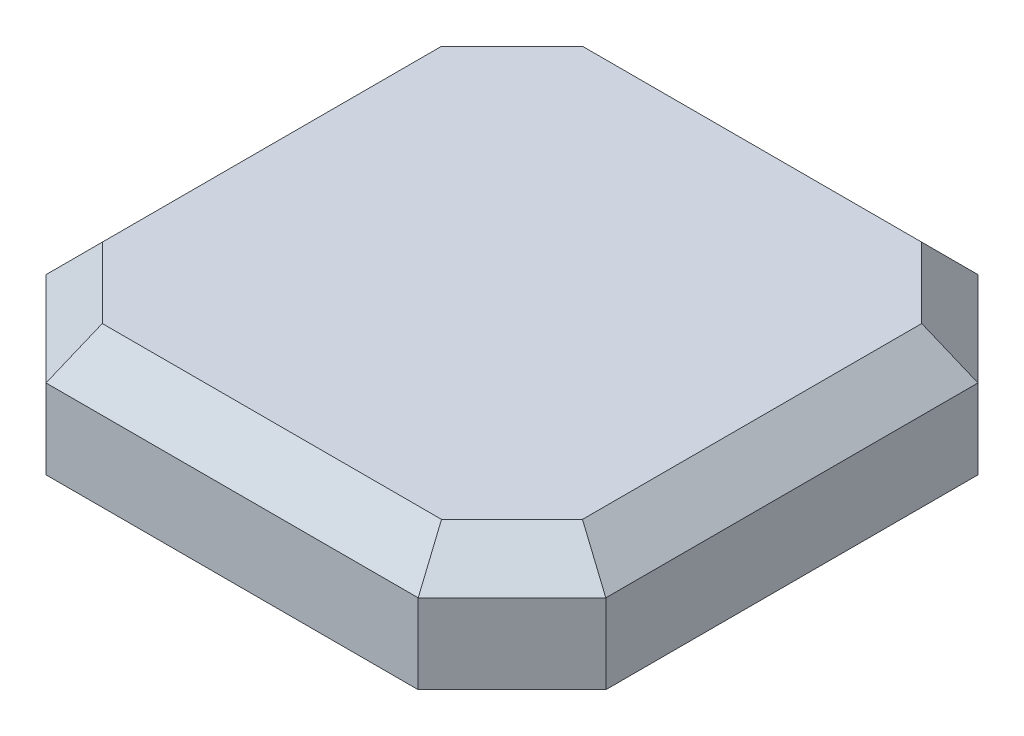
ISO-10303-21;
HEADER;
FILE_DESCRIPTION(('STEP AP214'),'2;1');
FILE_NAME('part.step','',(''),(''),'','','');
FILE_SCHEMA(('AUTOMOTIVE_DESIGN { 1 0 10303 214 1 1 1 1 }'));
ENDSEC;
DATA;
#1=APPLICATION_CONTEXT('core data for automotive mechanical design processes');
#2=APPLICATION_PROTOCOL_DEFINITION('international standard','automotive_design',2000,#1);
#3=PRODUCT_CONTEXT('',#1,'mechanical');
#4=PRODUCT('Part','Part','',(#3));
#5=PRODUCT_RELATED_PRODUCT_CATEGORY('part','',(#4));
#6=PRODUCT_DEFINITION_FORMATION('','',#4);
#7=PRODUCT_DEFINITION_CONTEXT('part definition',#1,'design');
#8=PRODUCT_DEFINITION('design','',#6,#7);
#9=PRODUCT_DEFINITION_SHAPE('','',#8);
#10=(LENGTH_UNIT() NAMED_UNIT(*) SI_UNIT(.MILLI.,.METRE.));
#11=(NAMED_UNIT(*) PLANE_ANGLE_UNIT() SI_UNIT($,.RADIAN.));
#12=(NAMED_UNIT(*) SI_UNIT($,.STERADIAN.) SOLID_ANGLE_UNIT());
#13=UNCERTAINTY_MEASURE_WITH_UNIT(LENGTH_MEASURE(1.E-05),#10,'distance_accuracy_value','');
#14=(GEOMETRIC_REPRESENTATION_CONTEXT(3) GLOBAL_UNCERTAINTY_ASSIGNED_CONTEXT((#13)) GLOBAL_UNIT_ASSIGNED_CONTEXT((#10,
#11,#12)) REPRESENTATION_CONTEXT('',''));
#15=CARTESIAN_POINT('',(0.,0.,0.));
#16=DIRECTION('',(0.,0.,1.));
#17=DIRECTION('',(1.,0.,0.));
#18=AXIS2_PLACEMENT_3D('',#15,#16,#17);
#19=CARTESIAN_POINT('',(-18.4035621925041,9.,-20.2102447448742));
#20=DIRECTION('',(0.,0.,1.));
#21=DIRECTION('',(1.,0.,0.));
#22=AXIS2_PLACEMENT_3D('',#19,#20,#21);
#23=PLANE('',#22);
#24=DIRECTION('',(0.,-1.,0.));
#25=VECTOR('',#24,1.);
#26=CARTESIAN_POINT('',(-18.4035621925041,9.,-20.2102447448742));
#27=LINE('',#26,#25);
#28=CARTESIAN_POINT('',(-18.4035621925041,6.,-20.2102447448742));
#29=VERTEX_POINT('',#28);
#30=CARTESIAN_POINT('',(-18.4035621925041,0.,-20.2102447448742));
#31=VERTEX_POINT('',#30);
#32=EDGE_CURVE('E135',#29,#31,#27,.T.);
#33=ORIENTED_EDGE('',*,*,#32,.F.);
#34=DIRECTION('',(1.,0.,0.));
#35=VECTOR('',#34,1.);
#36=CARTESIAN_POINT('',(9.65430218376519,6.,-20.210244744874));
#37=LINE('',#36,#35);
#38=CARTESIAN_POINT('',(9.65430218376519,6.,-20.210244744874));
#39=VERTEX_POINT('',#38);
#40=EDGE_CURVE('E255',#29,#39,#37,.T.);
#41=ORIENTED_EDGE('',*,*,#40,.T.);
#42=DIRECTION('',(0.,-1.,0.));
#43=VECTOR('',#42,1.);
#44=CARTESIAN_POINT('',(9.65430218376519,9.,-20.210244744874));
#45=LINE('',#44,#43);
#46=CARTESIAN_POINT('',(9.65430218376519,0.,-20.210244744874));
#47=VERTEX_POINT('',#46);
#48=EDGE_CURVE('E158',#39,#47,#45,.T.);
#49=ORIENTED_EDGE('',*,*,#48,.T.);
#50=DIRECTION('',(-1.,0.,0.));
#51=VECTOR('',#50,1.);
#52=CARTESIAN_POINT('',(-18.4035621925041,0.,-20.2102447448742));
#53=LINE('',#52,#51);
#54=EDGE_CURVE('E151',#47,#31,#53,.T.);
#55=ORIENTED_EDGE('',*,*,#54,.T.);
#56=EDGE_LOOP('',(#33,#41,#49,#55));
#57=FACE_BOUND('',#56,.T.);
#58=ADVANCED_FACE('F45',(#57),#23,.F.);
#59=CARTESIAN_POINT('',(-18.4035621925041,9.,-20.2102447448742));
#60=DIRECTION('',(0.707106781186551,0.,0.707106781186544));
#61=DIRECTION('',(0.707106781186544,0.,-0.707106781186551));
#62=AXIS2_PLACEMENT_3D('',#59,#60,#61);
#63=PLANE('',#62);
#64=DIRECTION('',(0.,-1.,0.));
#65=VECTOR('',#64,1.);
#66=CARTESIAN_POINT('',(-25.4746300043695,9.,-13.1391769330087));
#67=LINE('',#66,#65);
#68=CARTESIAN_POINT('',(-25.4746300043695,6.,-13.1391769330087));
#69=VERTEX_POINT('',#68);
#70=CARTESIAN_POINT('',(-25.4746300043695,0.,-13.1391769330087));
#71=VERTEX_POINT('',#70);
#72=EDGE_CURVE('E145',#69,#71,#67,.T.);
#73=ORIENTED_EDGE('',*,*,#72,.F.);
#74=DIRECTION('',(0.707106781186544,0.,-0.707106781186551));
#75=VECTOR('',#74,1.);
#76=CARTESIAN_POINT('',(-18.4035621925041,6.,-20.2102447448742));
#77=LINE('',#76,#75);
#78=EDGE_CURVE('E62',#69,#29,#77,.T.);
#79=ORIENTED_EDGE('',*,*,#78,.T.);
#80=ORIENTED_EDGE('',*,*,#32,.T.);
#81=DIRECTION('',(-0.707106781186544,0.,0.707106781186551));
#82=VECTOR('',#81,1.);
#83=CARTESIAN_POINT('',(-18.4035621925041,0.,-20.2102447448742));
#84=LINE('',#83,#82);
#85=EDGE_CURVE('E138',#31,#71,#84,.T.);
#86=ORIENTED_EDGE('',*,*,#85,.T.);
#87=EDGE_LOOP('',(#73,#79,#80,#86));
#88=FACE_BOUND('',#87,.T.);
#89=ADVANCED_FACE('F137',(#88),#63,.F.);
#90=CARTESIAN_POINT('',(-25.4746300043693,9.,14.9186874432606));
#91=DIRECTION('',(1.,0.,0.));
#92=DIRECTION('',(0.,0.,-1.));
#93=AXIS2_PLACEMENT_3D('',#90,#91,#92);
#94=PLANE('',#93);
#95=DIRECTION('',(0.,-1.,0.));
#96=VECTOR('',#95,1.);
#97=CARTESIAN_POINT('',(-25.4746300043693,9.,14.9186874432606));
#98=LINE('',#97,#96);
#99=CARTESIAN_POINT('',(-25.4746300043693,6.,14.9186874432606));
#100=VERTEX_POINT('',#99);
#101=CARTESIAN_POINT('',(-25.4746300043693,0.,14.9186874432606));
#102=VERTEX_POINT('',#101);
#103=EDGE_CURVE('E206',#100,#102,#98,.T.);
#104=ORIENTED_EDGE('',*,*,#103,.F.);
#105=DIRECTION('',(0.,0.,-1.));
#106=VECTOR('',#105,1.);
#107=CARTESIAN_POINT('',(-25.4746300043695,6.,-13.1391769330087));
#108=LINE('',#107,#106);
#109=EDGE_CURVE('E70',#100,#69,#108,.T.);
#110=ORIENTED_EDGE('',*,*,#109,.T.);
#111=ORIENTED_EDGE('',*,*,#72,.T.);
#112=DIRECTION('',(0.,0.,1.));
#113=VECTOR('',#112,1.);
#114=CARTESIAN_POINT('',(-25.4746300043693,0.,14.9186874432606));
#115=LINE('',#114,#113);
#116=EDGE_CURVE('E154',#71,#102,#115,.T.);
#117=ORIENTED_EDGE('',*,*,#116,.T.);
#118=EDGE_LOOP('',(#104,#110,#111,#117));
#119=FACE_BOUND('',#118,.T.);
#120=ADVANCED_FACE('F329',(#119),#94,.F.);
#121=CARTESIAN_POINT('',(-25.4746300043693,9.,14.9186874432606));
#122=DIRECTION('',(0.707106781186543,0.,-0.707106781186552));
#123=DIRECTION('',(-0.707106781186552,0.,-0.707106781186543));
#124=AXIS2_PLACEMENT_3D('',#121,#122,#123);
#125=PLANE('',#124);
#126=DIRECTION('',(0.,-1.,0.));
#127=VECTOR('',#126,1.);
#128=CARTESIAN_POINT('',(-18.4035621925038,9.,21.989755255126));
#129=LINE('',#128,#127);
#130=CARTESIAN_POINT('',(-18.4035621925038,6.,21.989755255126));
#131=VERTEX_POINT('',#130);
#132=CARTESIAN_POINT('',(-18.4035621925038,0.,21.989755255126));
#133=VERTEX_POINT('',#132);
#134=EDGE_CURVE('E203',#131,#133,#129,.T.);
#135=ORIENTED_EDGE('',*,*,#134,.F.);
#136=DIRECTION('',(-0.707106781186552,0.,-0.707106781186543));
#137=VECTOR('',#136,1.);
#138=CARTESIAN_POINT('',(-25.4746300043693,6.,14.9186874432606));
#139=LINE('',#138,#137);
#140=EDGE_CURVE('E248',#131,#100,#139,.T.);
#141=ORIENTED_EDGE('',*,*,#140,.T.);
#142=ORIENTED_EDGE('',*,*,#103,.T.);
#143=DIRECTION('',(0.707106781186552,0.,0.707106781186543));
#144=VECTOR('',#143,1.);
#145=CARTESIAN_POINT('',(-25.4746300043693,0.,14.9186874432606));
#146=LINE('',#145,#144);
#147=EDGE_CURVE('E173',#102,#133,#146,.T.);
#148=ORIENTED_EDGE('',*,*,#147,.T.);
#149=EDGE_LOOP('',(#135,#141,#142,#148));
#150=FACE_BOUND('',#149,.T.);
#151=ADVANCED_FACE('F392',(#150),#125,.F.);
#152=CARTESIAN_POINT('',(-18.4035621925038,9.,21.989755255126));
#153=DIRECTION('',(0.,0.,-1.));
#154=DIRECTION('',(-1.,0.,0.));
#155=AXIS2_PLACEMENT_3D('',#152,#153,#154);
#156=PLANE('',#155);
#157=DIRECTION('',(0.,-1.,0.));
#158=VECTOR('',#157,1.);
#159=CARTESIAN_POINT('',(9.65430218376526,9.,21.989755255126));
#160=LINE('',#159,#158);
#161=CARTESIAN_POINT('',(9.65430218376526,6.,21.989755255126));
#162=VERTEX_POINT('',#161);
#163=CARTESIAN_POINT('',(9.65430218376526,0.,21.989755255126));
#164=VERTEX_POINT('',#163);
#165=EDGE_CURVE('E200',#162,#164,#160,.T.);
#166=ORIENTED_EDGE('',*,*,#165,.F.);
#167=DIRECTION('',(-1.,0.,0.));
#168=VECTOR('',#167,1.);
#169=CARTESIAN_POINT('',(-18.4035621925038,6.,21.989755255126));
#170=LINE('',#169,#168);
#171=EDGE_CURVE('E245',#162,#131,#170,.T.);
#172=ORIENTED_EDGE('',*,*,#171,.T.);
#173=ORIENTED_EDGE('',*,*,#134,.T.);
#174=DIRECTION('',(1.,0.,0.));
#175=VECTOR('',#174,1.);
#176=CARTESIAN_POINT('',(-18.4035621925038,0.,21.989755255126));
#177=LINE('',#176,#175);
#178=EDGE_CURVE('E177',#133,#164,#177,.T.);
#179=ORIENTED_EDGE('',*,*,#178,.T.);
#180=EDGE_LOOP('',(#166,#172,#173,#179));
#181=FACE_BOUND('',#180,.T.);
#182=ADVANCED_FACE('F398',(#181),#156,.F.);
#183=CARTESIAN_POINT('',(9.65430218376526,9.,21.989755255126));
#184=DIRECTION('',(-0.707106781186551,0.,-0.707106781186544));
#185=DIRECTION('',(-0.707106781186544,0.,0.707106781186551));
#186=AXIS2_PLACEMENT_3D('',#183,#184,#185);
#187=PLANE('',#186);
#188=DIRECTION('',(0.,-1.,0.));
#189=VECTOR('',#188,1.);
#190=CARTESIAN_POINT('',(16.7253699956307,9.,14.9186874432605));
#191=LINE('',#190,#189);
#192=CARTESIAN_POINT('',(16.7253699956307,6.,14.9186874432605));
#193=VERTEX_POINT('',#192);
#194=CARTESIAN_POINT('',(16.7253699956307,0.,14.9186874432605));
#195=VERTEX_POINT('',#194);
#196=EDGE_CURVE('E197',#193,#195,#191,.T.);
#197=ORIENTED_EDGE('',*,*,#196,.F.);
#198=DIRECTION('',(-0.707106781186544,0.,0.707106781186551));
#199=VECTOR('',#198,1.);
#200=CARTESIAN_POINT('',(9.65430218376526,6.,21.989755255126));
#201=LINE('',#200,#199);
#202=EDGE_CURVE('E242',#193,#162,#201,.T.);
#203=ORIENTED_EDGE('',*,*,#202,.T.);
#204=ORIENTED_EDGE('',*,*,#165,.T.);
#205=DIRECTION('',(0.707106781186544,0.,-0.707106781186551));
#206=VECTOR('',#205,1.);
#207=CARTESIAN_POINT('',(9.65430218376526,0.,21.989755255126));
#208=LINE('',#207,#206);
#209=EDGE_CURVE('E181',#164,#195,#208,.T.);
#210=ORIENTED_EDGE('',*,*,#209,.T.);
#211=EDGE_LOOP('',(#197,#203,#204,#210));
#212=FACE_BOUND('',#211,.T.);
#213=ADVANCED_FACE('F401',(#212),#187,.F.);
#214=CARTESIAN_POINT('',(16.7253699956307,9.,14.9186874432605));
#215=DIRECTION('',(-1.,0.,0.));
#216=DIRECTION('',(0.,0.,1.));
#217=AXIS2_PLACEMENT_3D('',#214,#215,#216);
#218=PLANE('',#217);
#219=DIRECTION('',(0.,-1.,0.));
#220=VECTOR('',#219,1.);
#221=CARTESIAN_POINT('',(16.7253699956307,9.,-13.1391769330086));
#222=LINE('',#221,#220);
#223=CARTESIAN_POINT('',(16.7253699956307,6.,-13.1391769330086));
#224=VERTEX_POINT('',#223);
#225=CARTESIAN_POINT('',(16.7253699956307,0.,-13.1391769330086));
#226=VERTEX_POINT('',#225);
#227=EDGE_CURVE('E194',#224,#226,#222,.T.);
#228=ORIENTED_EDGE('',*,*,#227,.F.);
#229=DIRECTION('',(0.,0.,1.));
#230=VECTOR('',#229,1.);
#231=CARTESIAN_POINT('',(16.7253699956307,6.,14.9186874432605));
#232=LINE('',#231,#230);
#233=EDGE_CURVE('E239',#224,#193,#232,.T.);
#234=ORIENTED_EDGE('',*,*,#233,.T.);
#235=ORIENTED_EDGE('',*,*,#196,.T.);
#236=DIRECTION('',(0.,0.,-1.));
#237=VECTOR('',#236,1.);
#238=CARTESIAN_POINT('',(16.7253699956307,0.,14.9186874432605));
#239=LINE('',#238,#237);
#240=EDGE_CURVE('E185',#195,#226,#239,.T.);
#241=ORIENTED_EDGE('',*,*,#240,.T.);
#242=EDGE_LOOP('',(#228,#234,#235,#241));
#243=FACE_BOUND('',#242,.T.);
#244=ADVANCED_FACE('F421',(#243),#218,.F.);
#245=CARTESIAN_POINT('',(16.7253699956307,9.,-13.1391769330086));
#246=DIRECTION('',(-0.707106781186544,0.,0.707106781186552));
#247=DIRECTION('',(0.707106781186552,0.,0.707106781186544));
#248=AXIS2_PLACEMENT_3D('',#245,#246,#247);
#249=PLANE('',#248);
#250=ORIENTED_EDGE('',*,*,#48,.F.);
#251=DIRECTION('',(0.707106781186552,0.,0.707106781186544));
#252=VECTOR('',#251,1.);
#253=CARTESIAN_POINT('',(16.7253699956307,6.,-13.1391769330086));
#254=LINE('',#253,#252);
#255=EDGE_CURVE('E235',#39,#224,#254,.T.);
#256=ORIENTED_EDGE('',*,*,#255,.T.);
#257=ORIENTED_EDGE('',*,*,#227,.T.);
#258=DIRECTION('',(-0.707106781186551,0.,-0.707106781186543));
#259=VECTOR('',#258,1.);
#260=CARTESIAN_POINT('',(16.7253699956307,0.,-13.1391769330086));
#261=LINE('',#260,#259);
#262=EDGE_CURVE('E189',#226,#47,#261,.T.);
#263=ORIENTED_EDGE('',*,*,#262,.T.);
#264=EDGE_LOOP('',(#250,#256,#257,#263));
#265=FACE_BOUND('',#264,.T.);
#266=ADVANCED_FACE('F418',(#265),#249,.F.);
#267=CARTESIAN_POINT('',(0.,9.,0.));
#268=DIRECTION('',(0.,1.,0.));
#269=DIRECTION('',(0.,0.,1.));
#270=AXIS2_PLACEMENT_3D('',#267,#268,#269);
#271=PLANE('',#270);
#272=DIRECTION('',(0.,0.,-1.));
#273=VECTOR('',#272,1.);
#274=CARTESIAN_POINT('',(13.7253699956307,9.,-13.1391769330086));
#275=LINE('',#274,#273);
#276=CARTESIAN_POINT('',(13.7253699956307,9.,13.6760467561412));
#277=VERTEX_POINT('',#276);
#278=CARTESIAN_POINT('',(13.7253699956307,9.,-11.8965362458893));
#279=VERTEX_POINT('',#278);
#280=EDGE_CURVE('E228',#277,#279,#275,.T.);
#281=ORIENTED_EDGE('',*,*,#280,.T.);
#282=DIRECTION('',(-0.707106781186552,0.,-0.707106781186544));
#283=VECTOR('',#282,1.);
#284=CARTESIAN_POINT('',(7.53298184020556,9.,-18.0889244013144));
#285=LINE('',#284,#283);
#286=CARTESIAN_POINT('',(8.4116614966459,9.,-17.210244744874));
#287=VERTEX_POINT('',#286);
#288=EDGE_CURVE('E231',#279,#287,#285,.T.);
#289=ORIENTED_EDGE('',*,*,#288,.T.);
#290=DIRECTION('',(-1.,0.,0.));
#291=VECTOR('',#290,1.);
#292=CARTESIAN_POINT('',(-18.4035621925041,9.,-17.2102447448742));
#293=LINE('',#292,#291);
#294=CARTESIAN_POINT('',(-17.1609215053848,9.,-17.2102447448742));
#295=VERTEX_POINT('',#294);
#296=EDGE_CURVE('E144',#287,#295,#293,.T.);
#297=ORIENTED_EDGE('',*,*,#296,.T.);
#298=DIRECTION('',(-0.707106781186544,0.,0.707106781186551));
#299=VECTOR('',#298,1.);
#300=CARTESIAN_POINT('',(-23.3533096608099,9.,-11.0178565894491));
#301=LINE('',#300,#299);
#302=CARTESIAN_POINT('',(-22.4746300043695,9.,-11.8965362458894));
#303=VERTEX_POINT('',#302);
#304=EDGE_CURVE('E213',#295,#303,#301,.T.);
#305=ORIENTED_EDGE('',*,*,#304,.T.);
#306=DIRECTION('',(0.,0.,1.));
#307=VECTOR('',#306,1.);
#308=CARTESIAN_POINT('',(-22.4746300043693,9.,14.9186874432605));
#309=LINE('',#308,#307);
#310=CARTESIAN_POINT('',(-22.4746300043693,9.,13.6760467561413));
#311=VERTEX_POINT('',#310);
#312=EDGE_CURVE('E216',#303,#311,#309,.T.);
#313=ORIENTED_EDGE('',*,*,#312,.T.);
#314=DIRECTION('',(0.707106781186552,0.,0.707106781186543));
#315=VECTOR('',#314,1.);
#316=CARTESIAN_POINT('',(-16.2822418489442,9.,19.8684349115663));
#317=LINE('',#316,#315);
#318=CARTESIAN_POINT('',(-17.1609215053845,9.,18.989755255126));
#319=VERTEX_POINT('',#318);
#320=EDGE_CURVE('E219',#311,#319,#317,.T.);
#321=ORIENTED_EDGE('',*,*,#320,.T.);
#322=DIRECTION('',(1.,0.,0.));
#323=VECTOR('',#322,1.);
#324=CARTESIAN_POINT('',(9.65430218376526,9.,18.989755255126));
#325=LINE('',#324,#323);
#326=CARTESIAN_POINT('',(8.41166149664597,9.,18.989755255126));
#327=VERTEX_POINT('',#326);
#328=EDGE_CURVE('E222',#319,#327,#325,.T.);
#329=ORIENTED_EDGE('',*,*,#328,.T.);
#330=DIRECTION('',(0.707106781186544,0.,-0.707106781186551));
#331=VECTOR('',#330,1.);
#332=CARTESIAN_POINT('',(14.604049652071,9.,12.7973670997008));
#333=LINE('',#332,#331);
#334=EDGE_CURVE('E225',#327,#277,#333,.T.);
#335=ORIENTED_EDGE('',*,*,#334,.T.);
#336=EDGE_LOOP('',(#281,#289,#297,#305,#313,#321,#329,#335));
#337=FACE_BOUND('',#336,.T.);
#338=ADVANCED_FACE('F298',(#337),#271,.T.);
#339=CARTESIAN_POINT('',(0.,0.,0.));
#340=DIRECTION('',(0.,1.,0.));
#341=DIRECTION('',(0.,0.,1.));
#342=AXIS2_PLACEMENT_3D('',#339,#340,#341);
#343=PLANE('',#342);
#344=CARTESIAN_POINT('',(-18.1840918223829,0.,14.6992170731394));
#345=DIRECTION('',(0.,1.,0.));
#346=DIRECTION('',(0.,0.,1.));
#347=AXIS2_PLACEMENT_3D('',#344,#345,#346);
#348=CIRCLE('',#347,3.);
#349=CARTESIAN_POINT('',(-18.1840918223829,0.,17.6992170731394));
#350=VERTEX_POINT('',#349);
#351=EDGE_CURVE('E11',#350,#350,#348,.F.);
#352=ORIENTED_EDGE('',*,*,#351,.F.);
#353=EDGE_LOOP('',(#352));
#354=FACE_BOUND('',#353,.T.);
#355=CARTESIAN_POINT('',(-18.1840918223828,0.,-12.9197065628881));
#356=DIRECTION('',(0.,1.,0.));
#357=DIRECTION('',(0.,0.,1.));
#358=AXIS2_PLACEMENT_3D('',#355,#356,#357);
#359=CIRCLE('',#358,3.);
#360=CARTESIAN_POINT('',(-18.1840918223828,0.,-9.91970656288806));
#361=VERTEX_POINT('',#360);
#362=EDGE_CURVE('E55',#361,#361,#359,.F.);
#363=ORIENTED_EDGE('',*,*,#362,.F.);
#364=EDGE_LOOP('',(#363));
#365=FACE_BOUND('',#364,.T.);
#366=CARTESIAN_POINT('',(9.43483181364467,0.,-12.9197065628878));
#367=DIRECTION('',(0.,1.,0.));
#368=DIRECTION('',(0.,0.,1.));
#369=AXIS2_PLACEMENT_3D('',#366,#367,#368);
#370=CIRCLE('',#369,3.);
#371=CARTESIAN_POINT('',(9.43483181364467,0.,-9.91970656288782));
#372=VERTEX_POINT('',#371);
#373=EDGE_CURVE('E287',#372,#372,#370,.F.);
#374=ORIENTED_EDGE('',*,*,#373,.F.);
#375=EDGE_LOOP('',(#374));
#376=FACE_BOUND('',#375,.T.);
#377=CARTESIAN_POINT('',(9.43483181364433,0.,14.6992170731396));
#378=DIRECTION('',(0.,1.,0.));
#379=DIRECTION('',(0.,0.,1.));
#380=AXIS2_PLACEMENT_3D('',#377,#378,#379);
#381=CIRCLE('',#380,3.);
#382=CARTESIAN_POINT('',(9.43483181364433,0.,17.6992170731396));
#383=VERTEX_POINT('',#382);
#384=EDGE_CURVE('E258',#383,#383,#381,.F.);
#385=ORIENTED_EDGE('',*,*,#384,.F.);
#386=EDGE_LOOP('',(#385));
#387=FACE_BOUND('',#386,.T.);
#388=ORIENTED_EDGE('',*,*,#54,.F.);
#389=ORIENTED_EDGE('',*,*,#262,.F.);
#390=ORIENTED_EDGE('',*,*,#240,.F.);
#391=ORIENTED_EDGE('',*,*,#209,.F.);
#392=ORIENTED_EDGE('',*,*,#178,.F.);
#393=ORIENTED_EDGE('',*,*,#147,.F.);
#394=ORIENTED_EDGE('',*,*,#116,.F.);
#395=ORIENTED_EDGE('',*,*,#85,.F.);
#396=EDGE_LOOP('',(#388,#389,#390,#391,#392,#393,#394,#395));
#397=FACE_BOUND('',#396,.T.);
#398=ADVANCED_FACE('F149',(#354,#365,#376,#387,#397),#343,.F.);
#399=CARTESIAN_POINT('',(-18.0753383802552,9.,18.0753383802554));
#400=DIRECTION('',(-0.499999999999998,0.707106781186546,0.500000000000004));
#401=DIRECTION('',(-0.707106781186552,0.,-0.707106781186543));
#402=AXIS2_PLACEMENT_3D('',#399,#400,#401);
#403=PLANE('',#402);
#404=DIRECTION('',(0.678598344545845,0.678598344545848,-0.281084637714823));
#405=VECTOR('',#404,1.);
#406=CARTESIAN_POINT('',(-19.8660120249335,11.6086179794358,12.5955218100086));
#407=LINE('',#406,#405);
#408=EDGE_CURVE('E165',#100,#311,#407,.T.);
#409=ORIENTED_EDGE('',*,*,#408,.F.);
#410=ORIENTED_EDGE('',*,*,#140,.F.);
#411=DIRECTION('',(0.281084637714816,0.678598344545849,-0.678598344545847));
#412=VECTOR('',#411,1.);
#413=CARTESIAN_POINT('',(-17.0587491392805,9.24666591194817,18.7430893431778));
#414=LINE('',#413,#412);
#415=EDGE_CURVE('E161',#319,#131,#414,.F.);
#416=ORIENTED_EDGE('',*,*,#415,.F.);
#417=ORIENTED_EDGE('',*,*,#320,.F.);
#418=EDGE_LOOP('',(#409,#410,#416,#417));
#419=FACE_BOUND('',#418,.T.);
#420=ADVANCED_FACE('F48',(#419),#403,.T.);
#421=CARTESIAN_POINT('',(0.,9.,18.989755255126));
#422=DIRECTION('',(0.,0.707106781186547,0.707106781186548));
#423=DIRECTION('',(-1.,0.,0.));
#424=AXIS2_PLACEMENT_3D('',#421,#422,#423);
#425=PLANE('',#424);
#426=ORIENTED_EDGE('',*,*,#415,.T.);
#427=ORIENTED_EDGE('',*,*,#171,.F.);
#428=DIRECTION('',(-0.281084637714822,0.678598344545847,-0.678598344545846));
#429=VECTOR('',#428,1.);
#430=CARTESIAN_POINT('',(7.74706812053252,10.6044703420764,17.3852849130496));
#431=LINE('',#430,#429);
#432=EDGE_CURVE('E277',#327,#162,#431,.F.);
#433=ORIENTED_EDGE('',*,*,#432,.F.);
#434=ORIENTED_EDGE('',*,*,#328,.F.);
#435=EDGE_LOOP('',(#426,#427,#433,#434));
#436=FACE_BOUND('',#435,.T.);
#437=ADVANCED_FACE('F373',(#436),#425,.T.);
#438=CARTESIAN_POINT('',(-22.4746300043694,9.,1.63964640916247E-13));
#439=DIRECTION('',(-0.707106781186548,0.707106781186547,0.));
#440=DIRECTION('',(0.,0.,-1.));
#441=AXIS2_PLACEMENT_3D('',#438,#439,#440);
#442=PLANE('',#441);
#443=ORIENTED_EDGE('',*,*,#408,.T.);
#444=ORIENTED_EDGE('',*,*,#312,.F.);
#445=DIRECTION('',(0.678598344545848,0.678598344545847,0.281084637714816));
#446=VECTOR('',#445,1.);
#447=CARTESIAN_POINT('',(-21.0478982722053,10.4267317321642,-11.305564612559));
#448=LINE('',#447,#446);
#449=EDGE_CURVE('E273',#69,#303,#448,.T.);
#450=ORIENTED_EDGE('',*,*,#449,.F.);
#451=ORIENTED_EDGE('',*,*,#109,.F.);
#452=EDGE_LOOP('',(#443,#444,#450,#451));
#453=FACE_BOUND('',#452,.T.);
#454=ADVANCED_FACE('F367',(#453),#442,.T.);
#455=CARTESIAN_POINT('',(13.700708375886,9.,13.7007083758859));
#456=DIRECTION('',(0.500000000000003,0.707106781186547,0.499999999999998));
#457=DIRECTION('',(-0.707106781186544,0.,0.707106781186551));
#458=AXIS2_PLACEMENT_3D('',#455,#456,#457);
#459=PLANE('',#458);
#460=ORIENTED_EDGE('',*,*,#432,.T.);
#461=ORIENTED_EDGE('',*,*,#202,.F.);
#462=DIRECTION('',(-0.678598344545847,0.678598344545848,-0.281084637714818));
#463=VECTOR('',#462,1.);
#464=CARTESIAN_POINT('',(13.7187174708451,9.00665252478559,13.673291190151));
#465=LINE('',#464,#463);
#466=EDGE_CURVE('E269',#277,#193,#465,.F.);
#467=ORIENTED_EDGE('',*,*,#466,.F.);
#468=ORIENTED_EDGE('',*,*,#334,.F.);
#469=EDGE_LOOP('',(#460,#461,#467,#468));
#470=FACE_BOUND('',#469,.T.);
#471=ADVANCED_FACE('F360',(#470),#459,.T.);
#472=CARTESIAN_POINT('',(-17.1855831251296,9.,-17.1855831251294));
#473=DIRECTION('',(-0.500000000000003,0.707106781186547,-0.499999999999997));
#474=DIRECTION('',(0.707106781186544,0.,-0.707106781186551));
#475=AXIS2_PLACEMENT_3D('',#472,#473,#474);
#476=PLANE('',#475);
#477=ORIENTED_EDGE('',*,*,#449,.T.);
#478=ORIENTED_EDGE('',*,*,#304,.F.);
#479=DIRECTION('',(0.281084637714821,0.678598344545847,0.678598344545847));
#480=VECTOR('',#479,1.);
#481=CARTESIAN_POINT('',(-15.8050615762817,12.273335429519,-13.9369093153553));
#482=LINE('',#481,#480);
#483=EDGE_CURVE('E265',#29,#295,#482,.T.);
#484=ORIENTED_EDGE('',*,*,#483,.F.);
#485=ORIENTED_EDGE('',*,*,#78,.F.);
#486=EDGE_LOOP('',(#477,#478,#484,#485));
#487=FACE_BOUND('',#486,.T.);
#488=ADVANCED_FACE('F353',(#487),#476,.T.);
#489=CARTESIAN_POINT('',(13.7253699956307,9.,0.));
#490=DIRECTION('',(0.707106781186548,0.707106781186547,0.));
#491=DIRECTION('',(0.,0.,1.));
#492=AXIS2_PLACEMENT_3D('',#489,#490,#491);
#493=PLANE('',#492);
#494=ORIENTED_EDGE('',*,*,#466,.T.);
#495=ORIENTED_EDGE('',*,*,#233,.F.);
#496=DIRECTION('',(-0.678598344545846,0.678598344545847,0.281084637714823));
#497=VECTOR('',#496,1.);
#498=CARTESIAN_POINT('',(11.4561822034713,11.2691877921594,-10.9566078868054));
#499=LINE('',#498,#497);
#500=EDGE_CURVE('E262',#279,#224,#499,.F.);
#501=ORIENTED_EDGE('',*,*,#500,.F.);
#502=ORIENTED_EDGE('',*,*,#280,.F.);
#503=EDGE_LOOP('',(#494,#495,#501,#502));
#504=FACE_BOUND('',#503,.T.);
#505=ADVANCED_FACE('F346',(#504),#493,.T.);
#506=CARTESIAN_POINT('',(1.23429986030329E-13,9.,-17.2102447448741));
#507=DIRECTION('',(0.,0.707106781186547,-0.707106781186548));
#508=DIRECTION('',(1.,0.,0.));
#509=AXIS2_PLACEMENT_3D('',#506,#507,#508);
#510=PLANE('',#509);
#511=ORIENTED_EDGE('',*,*,#483,.T.);
#512=ORIENTED_EDGE('',*,*,#296,.F.);
#513=DIRECTION('',(0.281084637714821,-0.678598344545849,-0.678598344545845));
#514=VECTOR('',#513,1.);
#515=CARTESIAN_POINT('',(7.74706812053248,10.6044703420763,-15.6057744027977));
#516=LINE('',#515,#514);
#517=EDGE_CURVE('E259',#39,#287,#516,.F.);
#518=ORIENTED_EDGE('',*,*,#517,.F.);
#519=ORIENTED_EDGE('',*,*,#40,.F.);
#520=EDGE_LOOP('',(#511,#512,#518,#519));
#521=FACE_BOUND('',#520,.T.);
#522=ADVANCED_FACE('F339',(#521),#510,.T.);
#523=CARTESIAN_POINT('',(12.8109531207599,9.,-12.8109531207601));
#524=DIRECTION('',(0.499999999999998,0.707106781186547,-0.500000000000003));
#525=DIRECTION('',(0.707106781186552,0.,0.707106781186544));
#526=AXIS2_PLACEMENT_3D('',#523,#524,#525);
#527=PLANE('',#526);
#528=ORIENTED_EDGE('',*,*,#500,.T.);
#529=ORIENTED_EDGE('',*,*,#255,.F.);
#530=ORIENTED_EDGE('',*,*,#517,.T.);
#531=ORIENTED_EDGE('',*,*,#288,.F.);
#532=EDGE_LOOP('',(#528,#529,#530,#531));
#533=FACE_BOUND('',#532,.T.);
#534=ADVANCED_FACE('F319',(#533),#527,.T.);
#535=CARTESIAN_POINT('',(9.43483181364433,-1.,14.6992170731396));
#536=DIRECTION('',(0.,-1.,0.));
#537=DIRECTION('',(0.,0.,-1.));
#538=AXIS2_PLACEMENT_3D('',#535,#536,#537);
#539=PLANE('',#538);
#540=CARTESIAN_POINT('',(9.43483181364433,-1.,14.6992170731396));
#541=DIRECTION('',(0.,-1.,0.));
#542=DIRECTION('',(0.,0.,-1.));
#543=AXIS2_PLACEMENT_3D('',#540,#541,#542);
#544=CIRCLE('',#543,3.);
#545=CARTESIAN_POINT('',(9.43483181364433,-1.,11.6992170731396));
#546=VERTEX_POINT('',#545);
#547=EDGE_CURVE('E168',#546,#546,#544,.T.);
#548=ORIENTED_EDGE('',*,*,#547,.T.);
#549=EDGE_LOOP('',(#548));
#550=FACE_BOUND('',#549,.T.);
#551=CARTESIAN_POINT('',(9.43483181364433,-1.,14.6992170731396));
#552=DIRECTION('',(0.,-1.,0.));
#553=DIRECTION('',(0.,0.,-1.));
#554=AXIS2_PLACEMENT_3D('',#551,#552,#553);
#555=CIRCLE('',#554,2.5);
#556=CARTESIAN_POINT('',(9.43483181364433,-1.,12.1992170731396));
#557=VERTEX_POINT('',#556);
#558=EDGE_CURVE('E746',#557,#557,#555,.T.);
#559=ORIENTED_EDGE('',*,*,#558,.F.);
#560=EDGE_LOOP('',(#559));
#561=FACE_BOUND('',#560,.T.);
#562=ADVANCED_FACE('F310',(#550,#561),#539,.T.);
#563=CARTESIAN_POINT('',(9.43483181364433,-1.,14.6992170731396));
#564=DIRECTION('',(0.,1.,0.));
#565=DIRECTION('',(0.,0.,1.));
#566=AXIS2_PLACEMENT_3D('',#563,#564,#565);
#567=CYLINDRICAL_SURFACE('',#566,3.);
#568=ORIENTED_EDGE('',*,*,#547,.F.);
#569=EDGE_LOOP('',(#568));
#570=FACE_BOUND('',#569,.T.);
#571=ORIENTED_EDGE('',*,*,#384,.T.);
#572=EDGE_LOOP('',(#571));
#573=FACE_BOUND('',#572,.T.);
#574=ADVANCED_FACE('F307',(#570,#573),#567,.T.);
#575=CARTESIAN_POINT('',(9.43483181364433,-1.,14.6992170731396));
#576=DIRECTION('',(0.,1.,0.));
#577=DIRECTION('',(0.,0.,1.));
#578=AXIS2_PLACEMENT_3D('',#575,#576,#577);
#579=CYLINDRICAL_SURFACE('',#578,2.5);
#580=ORIENTED_EDGE('',*,*,#558,.T.);
#581=EDGE_LOOP('',(#580));
#582=FACE_BOUND('',#581,.T.);
#583=CARTESIAN_POINT('',(9.43483181364433,0.,14.6992170731396));
#584=DIRECTION('',(0.,-1.,0.));
#585=DIRECTION('',(0.,0.,-1.));
#586=AXIS2_PLACEMENT_3D('',#583,#584,#585);
#587=CIRCLE('',#586,2.5);
#588=CARTESIAN_POINT('',(9.43483181364433,0.,12.1992170731396));
#589=VERTEX_POINT('',#588);
#590=EDGE_CURVE('E742',#589,#589,#587,.T.);
#591=ORIENTED_EDGE('',*,*,#590,.F.);
#592=EDGE_LOOP('',(#591));
#593=FACE_BOUND('',#592,.T.);
#594=ADVANCED_FACE('F309',(#582,#593),#579,.F.);
#595=ORIENTED_EDGE('',*,*,#590,.T.);
#596=EDGE_LOOP('',(#595));
#597=FACE_BOUND('',#596,.T.);
#598=ADVANCED_FACE('F302',(#597),#343,.F.);
#599=CARTESIAN_POINT('',(9.43483181364467,-1.,-12.9197065628878));
#600=DIRECTION('',(0.,-1.,0.));
#601=DIRECTION('',(0.,0.,-1.));
#602=AXIS2_PLACEMENT_3D('',#599,#600,#601);
#603=PLANE('',#602);
#604=CARTESIAN_POINT('',(9.43483181364467,-1.,-12.9197065628878));
#605=DIRECTION('',(0.,-1.,0.));
#606=DIRECTION('',(0.,0.,-1.));
#607=AXIS2_PLACEMENT_3D('',#604,#605,#606);
#608=CIRCLE('',#607,3.);
#609=CARTESIAN_POINT('',(9.43483181364467,-1.,-15.9197065628878));
#610=VERTEX_POINT('',#609);
#611=EDGE_CURVE('E730',#610,#610,#608,.T.);
#612=ORIENTED_EDGE('',*,*,#611,.T.);
#613=EDGE_LOOP('',(#612));
#614=FACE_BOUND('',#613,.T.);
#615=CARTESIAN_POINT('',(9.43483181364467,-1.,-12.9197065628878));
#616=DIRECTION('',(0.,-1.,0.));
#617=DIRECTION('',(0.,0.,-1.));
#618=AXIS2_PLACEMENT_3D('',#615,#616,#617);
#619=CIRCLE('',#618,2.5);
#620=CARTESIAN_POINT('',(9.43483181364467,-1.,-15.4197065628878));
#621=VERTEX_POINT('',#620);
#622=EDGE_CURVE('E737',#621,#621,#619,.T.);
#623=ORIENTED_EDGE('',*,*,#622,.F.);
#624=EDGE_LOOP('',(#623));
#625=FACE_BOUND('',#624,.T.);
#626=ADVANCED_FACE('F564',(#614,#625),#603,.T.);
#627=CARTESIAN_POINT('',(9.43483181364467,-1.,-12.9197065628878));
#628=DIRECTION('',(0.,1.,0.));
#629=DIRECTION('',(0.,0.,1.));
#630=AXIS2_PLACEMENT_3D('',#627,#628,#629);
#631=CYLINDRICAL_SURFACE('',#630,3.);
#632=ORIENTED_EDGE('',*,*,#611,.F.);
#633=EDGE_LOOP('',(#632));
#634=FACE_BOUND('',#633,.T.);
#635=ORIENTED_EDGE('',*,*,#373,.T.);
#636=EDGE_LOOP('',(#635));
#637=FACE_BOUND('',#636,.T.);
#638=ADVANCED_FACE('F573',(#634,#637),#631,.T.);
#639=CARTESIAN_POINT('',(9.43483181364467,-1.,-12.9197065628878));
#640=DIRECTION('',(0.,1.,0.));
#641=DIRECTION('',(0.,0.,1.));
#642=AXIS2_PLACEMENT_3D('',#639,#640,#641);
#643=CYLINDRICAL_SURFACE('',#642,2.5);
#644=ORIENTED_EDGE('',*,*,#622,.T.);
#645=EDGE_LOOP('',(#644));
#646=FACE_BOUND('',#645,.T.);
#647=CARTESIAN_POINT('',(9.43483181364467,0.,-12.9197065628878));
#648=DIRECTION('',(0.,-1.,0.));
#649=DIRECTION('',(0.,0.,-1.));
#650=AXIS2_PLACEMENT_3D('',#647,#648,#649);
#651=CIRCLE('',#650,2.5);
#652=CARTESIAN_POINT('',(9.43483181364467,0.,-15.4197065628878));
#653=VERTEX_POINT('',#652);
#654=EDGE_CURVE('E738',#653,#653,#651,.T.);
#655=ORIENTED_EDGE('',*,*,#654,.F.);
#656=EDGE_LOOP('',(#655));
#657=FACE_BOUND('',#656,.T.);
#658=ADVANCED_FACE('F584',(#646,#657),#643,.F.);
#659=ORIENTED_EDGE('',*,*,#654,.T.);
#660=EDGE_LOOP('',(#659));
#661=FACE_BOUND('',#660,.T.);
#662=ADVANCED_FACE('F566',(#661),#343,.F.);
#663=CARTESIAN_POINT('',(-18.1840918223828,-1.,-12.9197065628881));
#664=DIRECTION('',(0.,-1.,0.));
#665=DIRECTION('',(0.,0.,-1.));
#666=AXIS2_PLACEMENT_3D('',#663,#664,#665);
#667=PLANE('',#666);
#668=CARTESIAN_POINT('',(-18.1840918223828,-1.,-12.9197065628881));
#669=DIRECTION('',(0.,-1.,0.));
#670=DIRECTION('',(0.,0.,-1.));
#671=AXIS2_PLACEMENT_3D('',#668,#669,#670);
#672=CIRCLE('',#671,3.);
#673=CARTESIAN_POINT('',(-18.1840918223828,-1.,-15.9197065628881));
#674=VERTEX_POINT('',#673);
#675=EDGE_CURVE('E713',#674,#674,#672,.T.);
#676=ORIENTED_EDGE('',*,*,#675,.T.);
#677=EDGE_LOOP('',(#676));
#678=FACE_BOUND('',#677,.T.);
#679=CARTESIAN_POINT('',(-18.1840918223828,-1.,-12.9197065628881));
#680=DIRECTION('',(0.,-1.,0.));
#681=DIRECTION('',(0.,0.,-1.));
#682=AXIS2_PLACEMENT_3D('',#679,#680,#681);
#683=CIRCLE('',#682,2.5);
#684=CARTESIAN_POINT('',(-18.1840918223828,-1.,-15.4197065628881));
#685=VERTEX_POINT('',#684);
#686=EDGE_CURVE('E719',#685,#685,#683,.T.);
#687=ORIENTED_EDGE('',*,*,#686,.F.);
#688=EDGE_LOOP('',(#687));
#689=FACE_BOUND('',#688,.T.);
#690=ADVANCED_FACE('F605',(#678,#689),#667,.T.);
#691=CARTESIAN_POINT('',(-18.1840918223828,-1.,-12.9197065628881));
#692=DIRECTION('',(0.,1.,0.));
#693=DIRECTION('',(0.,0.,1.));
#694=AXIS2_PLACEMENT_3D('',#691,#692,#693);
#695=CYLINDRICAL_SURFACE('',#694,3.);
#696=ORIENTED_EDGE('',*,*,#675,.F.);
#697=EDGE_LOOP('',(#696));
#698=FACE_BOUND('',#697,.T.);
#699=ORIENTED_EDGE('',*,*,#362,.T.);
#700=EDGE_LOOP('',(#699));
#701=FACE_BOUND('',#700,.T.);
#702=ADVANCED_FACE('F294',(#698,#701),#695,.T.);
#703=CARTESIAN_POINT('',(-18.1840918223828,-1.,-12.9197065628881));
#704=DIRECTION('',(0.,1.,0.));
#705=DIRECTION('',(0.,0.,1.));
#706=AXIS2_PLACEMENT_3D('',#703,#704,#705);
#707=CYLINDRICAL_SURFACE('',#706,2.5);
#708=ORIENTED_EDGE('',*,*,#686,.T.);
#709=EDGE_LOOP('',(#708));
#710=FACE_BOUND('',#709,.T.);
#711=CARTESIAN_POINT('',(-18.1840918223828,0.,-12.9197065628881));
#712=DIRECTION('',(0.,-1.,0.));
#713=DIRECTION('',(0.,0.,-1.));
#714=AXIS2_PLACEMENT_3D('',#711,#712,#713);
#715=CIRCLE('',#714,2.5);
#716=CARTESIAN_POINT('',(-18.1840918223828,0.,-15.4197065628881));
#717=VERTEX_POINT('',#716);
#718=EDGE_CURVE('E726',#717,#717,#715,.T.);
#719=ORIENTED_EDGE('',*,*,#718,.F.);
#720=EDGE_LOOP('',(#719));
#721=FACE_BOUND('',#720,.T.);
#722=ADVANCED_FACE('F625',(#710,#721),#707,.F.);
#723=ORIENTED_EDGE('',*,*,#718,.T.);
#724=EDGE_LOOP('',(#723));
#725=FACE_BOUND('',#724,.T.);
#726=ADVANCED_FACE('F607',(#725),#343,.F.);
#727=CARTESIAN_POINT('',(-18.1840918223829,-1.,14.6992170731394));
#728=DIRECTION('',(0.,-1.,0.));
#729=DIRECTION('',(0.,0.,-1.));
#730=AXIS2_PLACEMENT_3D('',#727,#728,#729);
#731=PLANE('',#730);
#732=CARTESIAN_POINT('',(-18.1840918223829,-1.,14.6992170731394));
#733=DIRECTION('',(0.,-1.,0.));
#734=DIRECTION('',(0.,0.,-1.));
#735=AXIS2_PLACEMENT_3D('',#732,#733,#734);
#736=CIRCLE('',#735,3.);
#737=CARTESIAN_POINT('',(-18.1840918223829,-1.,11.6992170731394));
#738=VERTEX_POINT('',#737);
#739=EDGE_CURVE('E722',#738,#738,#736,.T.);
#740=ORIENTED_EDGE('',*,*,#739,.T.);
#741=EDGE_LOOP('',(#740));
#742=FACE_BOUND('',#741,.T.);
#743=CARTESIAN_POINT('',(-18.1840918223829,-1.,14.6992170731394));
#744=DIRECTION('',(0.,-1.,0.));
#745=DIRECTION('',(0.,0.,-1.));
#746=AXIS2_PLACEMENT_3D('',#743,#744,#745);
#747=CIRCLE('',#746,2.5);
#748=CARTESIAN_POINT('',(-18.1840918223829,-1.,12.1992170731394));
#749=VERTEX_POINT('',#748);
#750=EDGE_CURVE('E714',#749,#749,#747,.T.);
#751=ORIENTED_EDGE('',*,*,#750,.F.);
#752=EDGE_LOOP('',(#751));
#753=FACE_BOUND('',#752,.T.);
#754=ADVANCED_FACE('F646',(#742,#753),#731,.T.);
#755=CARTESIAN_POINT('',(-18.1840918223829,-1.,14.6992170731394));
#756=DIRECTION('',(0.,1.,0.));
#757=DIRECTION('',(0.,0.,1.));
#758=AXIS2_PLACEMENT_3D('',#755,#756,#757);
#759=CYLINDRICAL_SURFACE('',#758,3.);
#760=ORIENTED_EDGE('',*,*,#739,.F.);
#761=EDGE_LOOP('',(#760));
#762=FACE_BOUND('',#761,.T.);
#763=ORIENTED_EDGE('',*,*,#351,.T.);
#764=EDGE_LOOP('',(#763));
#765=FACE_BOUND('',#764,.T.);
#766=ADVANCED_FACE('F655',(#762,#765),#759,.T.);
#767=CARTESIAN_POINT('',(-18.1840918223829,-1.,14.6992170731394));
#768=DIRECTION('',(0.,1.,0.));
#769=DIRECTION('',(0.,0.,1.));
#770=AXIS2_PLACEMENT_3D('',#767,#768,#769);
#771=CYLINDRICAL_SURFACE('',#770,2.5);
#772=ORIENTED_EDGE('',*,*,#750,.T.);
#773=EDGE_LOOP('',(#772));
#774=FACE_BOUND('',#773,.T.);
#775=CARTESIAN_POINT('',(-18.1840918223829,0.,14.6992170731394));
#776=DIRECTION('',(0.,-1.,0.));
#777=DIRECTION('',(0.,0.,-1.));
#778=AXIS2_PLACEMENT_3D('',#775,#776,#777);
#779=CIRCLE('',#778,2.5);
#780=CARTESIAN_POINT('',(-18.1840918223829,0.,12.1992170731394));
#781=VERTEX_POINT('',#780);
#782=EDGE_CURVE('E710',#781,#781,#779,.T.);
#783=ORIENTED_EDGE('',*,*,#782,.F.);
#784=EDGE_LOOP('',(#783));
#785=FACE_BOUND('',#784,.T.);
#786=ADVANCED_FACE('F666',(#774,#785),#771,.F.);
#787=ORIENTED_EDGE('',*,*,#782,.T.);
#788=EDGE_LOOP('',(#787));
#789=FACE_BOUND('',#788,.T.);
#790=ADVANCED_FACE('F301',(#789),#343,.F.);
#791=CLOSED_SHELL('',(#58,#89,#120,#151,#182,#213,#244,#266,#338,#398,#420,#437,#454,#471,#488,
#505,#522,#534,#562,#574,#594,#598,#626,#638,#658,#662,#690,#702,#722,#726,#754,#766,#786,#790));
#792=MANIFOLD_SOLID_BREP('B2',#791);
#793=ADVANCED_BREP_SHAPE_REPRESENTATION('',(#18,#792),#14);
#794=SHAPE_DEFINITION_REPRESENTATION(#9,#793);
ENDSEC;
END-ISO-10303-21;
